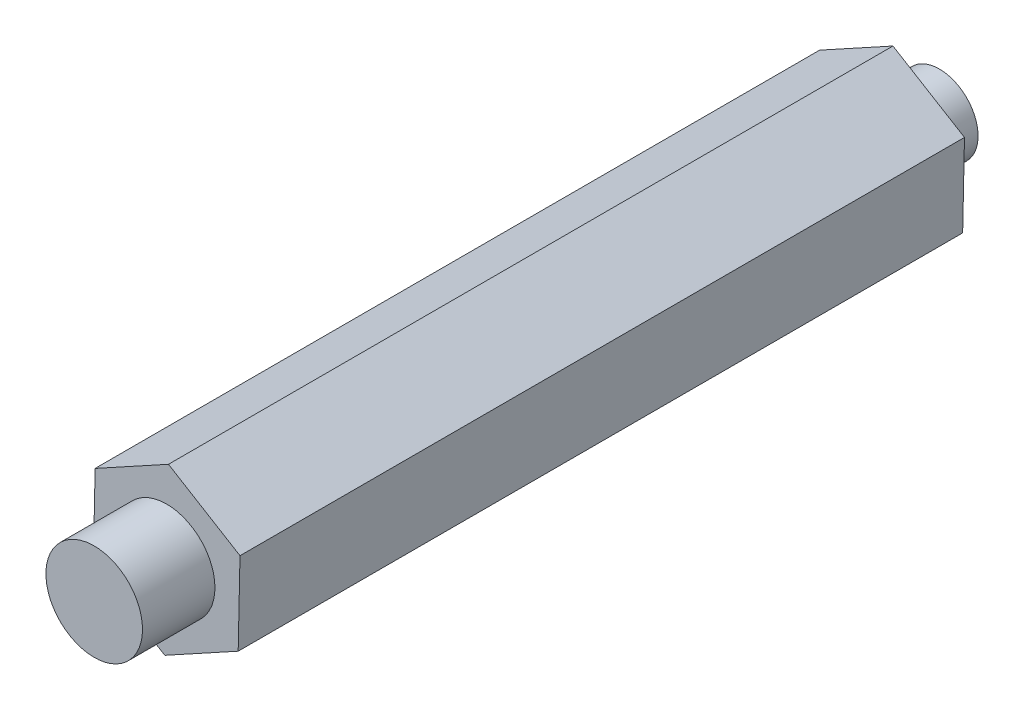
ISO-10303-21;
HEADER;
FILE_DESCRIPTION(('STEP AP214'),'2;1');
FILE_NAME('part.step','',(''),(''),'','','');
FILE_SCHEMA(('AUTOMOTIVE_DESIGN { 1 0 10303 214 1 1 1 1 }'));
ENDSEC;
DATA;
#1=APPLICATION_CONTEXT('core data for automotive mechanical design processes');
#2=APPLICATION_PROTOCOL_DEFINITION('international standard','automotive_design',2000,#1);
#3=PRODUCT_CONTEXT('',#1,'mechanical');
#4=PRODUCT('Part','Part','',(#3));
#5=PRODUCT_RELATED_PRODUCT_CATEGORY('part','',(#4));
#6=PRODUCT_DEFINITION_FORMATION('','',#4);
#7=PRODUCT_DEFINITION_CONTEXT('part definition',#1,'design');
#8=PRODUCT_DEFINITION('design','',#6,#7);
#9=PRODUCT_DEFINITION_SHAPE('','',#8);
#10=(LENGTH_UNIT() NAMED_UNIT(*) SI_UNIT(.MILLI.,.METRE.));
#11=(NAMED_UNIT(*) PLANE_ANGLE_UNIT() SI_UNIT($,.RADIAN.));
#12=(NAMED_UNIT(*) SI_UNIT($,.STERADIAN.) SOLID_ANGLE_UNIT());
#13=UNCERTAINTY_MEASURE_WITH_UNIT(LENGTH_MEASURE(1.E-05),#10,'distance_accuracy_value','');
#14=(GEOMETRIC_REPRESENTATION_CONTEXT(3) GLOBAL_UNCERTAINTY_ASSIGNED_CONTEXT((#13)) GLOBAL_UNIT_ASSIGNED_CONTEXT((#10,
#11,#12)) REPRESENTATION_CONTEXT('',''));
#15=CARTESIAN_POINT('',(0.,0.,0.));
#16=DIRECTION('',(0.,0.,1.));
#17=DIRECTION('',(1.,0.,0.));
#18=AXIS2_PLACEMENT_3D('',#15,#16,#17);
#19=CARTESIAN_POINT('',(-0.0753833749567967,-3.46328129766846,30.));
#20=DIRECTION('',(-0.481035753632871,0.876700977373047,0.));
#21=DIRECTION('',(-0.876700977373047,-0.481035753632871,0.));
#22=AXIS2_PLACEMENT_3D('',#19,#20,#21);
#23=PLANE('',#22);
#24=DIRECTION('',(0.876700977373047,0.481035753632871,0.));
#25=VECTOR('',#24,1.);
#26=CARTESIAN_POINT('',(-0.0753833749567967,-3.46328129766846,0.));
#27=LINE('',#26,#25);
#28=CARTESIAN_POINT('',(-0.0753833749567967,-3.46328129766846,0.));
#29=VERTEX_POINT('',#28);
#30=CARTESIAN_POINT('',(2.96159789675402,-1.79692456656982,0.));
#31=VERTEX_POINT('',#30);
#32=EDGE_CURVE('E124',#29,#31,#27,.T.);
#33=ORIENTED_EDGE('',*,*,#32,.T.);
#34=DIRECTION('',(0.,0.,-1.));
#35=VECTOR('',#34,1.);
#36=CARTESIAN_POINT('',(2.96159789675402,-1.79692456656982,30.));
#37=LINE('',#36,#35);
#38=CARTESIAN_POINT('',(2.96159789675402,-1.79692456656982,30.));
#39=VERTEX_POINT('',#38);
#40=EDGE_CURVE('E40',#39,#31,#37,.T.);
#41=ORIENTED_EDGE('',*,*,#40,.F.);
#42=DIRECTION('',(0.876700977373047,0.481035753632871,0.));
#43=VECTOR('',#42,1.);
#44=CARTESIAN_POINT('',(-0.0753833749567967,-3.46328129766846,30.));
#45=LINE('',#44,#43);
#46=CARTESIAN_POINT('',(-0.0753833749567967,-3.46328129766846,30.));
#47=VERTEX_POINT('',#46);
#48=EDGE_CURVE('E135',#47,#39,#45,.T.);
#49=ORIENTED_EDGE('',*,*,#48,.F.);
#50=DIRECTION('',(0.,0.,-1.));
#51=VECTOR('',#50,1.);
#52=CARTESIAN_POINT('',(-0.0753833749567967,-3.46328129766846,30.));
#53=LINE('',#52,#51);
#54=EDGE_CURVE('E120',#47,#29,#53,.T.);
#55=ORIENTED_EDGE('',*,*,#54,.T.);
#56=EDGE_LOOP('',(#33,#41,#49,#55));
#57=FACE_BOUND('',#56,.T.);
#58=ADVANCED_FACE('F37',(#57),#23,.F.);
#59=CARTESIAN_POINT('',(2.96159789675402,-1.79692456656982,30.));
#60=DIRECTION('',(-0.99976319474414,0.0217613059118645,0.));
#61=DIRECTION('',(-0.0217613059118645,-0.999763194744141,0.));
#62=AXIS2_PLACEMENT_3D('',#59,#60,#61);
#63=PLANE('',#62);
#64=DIRECTION('',(0.0217613059118645,0.99976319474414,0.));
#65=VECTOR('',#64,1.);
#66=CARTESIAN_POINT('',(2.96159789675402,-1.79692456656982,0.));
#67=LINE('',#66,#65);
#68=CARTESIAN_POINT('',(3.03698127171082,1.66635673109864,0.));
#69=VERTEX_POINT('',#68);
#70=EDGE_CURVE('E127',#31,#69,#67,.T.);
#71=ORIENTED_EDGE('',*,*,#70,.T.);
#72=DIRECTION('',(0.,0.,-1.));
#73=VECTOR('',#72,1.);
#74=CARTESIAN_POINT('',(3.03698127171082,1.66635673109864,30.));
#75=LINE('',#74,#73);
#76=CARTESIAN_POINT('',(3.03698127171082,1.66635673109864,30.));
#77=VERTEX_POINT('',#76);
#78=EDGE_CURVE('E138',#77,#69,#75,.T.);
#79=ORIENTED_EDGE('',*,*,#78,.F.);
#80=DIRECTION('',(0.0217613059118645,0.99976319474414,0.));
#81=VECTOR('',#80,1.);
#82=CARTESIAN_POINT('',(2.96159789675402,-1.79692456656982,30.));
#83=LINE('',#82,#81);
#84=EDGE_CURVE('E93',#39,#77,#83,.T.);
#85=ORIENTED_EDGE('',*,*,#84,.F.);
#86=ORIENTED_EDGE('',*,*,#40,.T.);
#87=EDGE_LOOP('',(#71,#79,#85,#86));
#88=FACE_BOUND('',#87,.T.);
#89=ADVANCED_FACE('F151',(#88),#63,.F.);
#90=CARTESIAN_POINT('',(3.03698127171082,1.66635673109864,30.));
#91=DIRECTION('',(-0.518727441111269,-0.854939671461183,0.));
#92=DIRECTION('',(0.854939671461183,-0.518727441111269,0.));
#93=AXIS2_PLACEMENT_3D('',#90,#91,#92);
#94=PLANE('',#93);
#95=DIRECTION('',(-0.854939671461183,0.518727441111269,0.));
#96=VECTOR('',#95,1.);
#97=CARTESIAN_POINT('',(3.03698127171082,1.66635673109864,0.));
#98=LINE('',#97,#96);
#99=CARTESIAN_POINT('',(0.0753833749567957,3.46328129766846,0.));
#100=VERTEX_POINT('',#99);
#101=EDGE_CURVE('E130',#69,#100,#98,.T.);
#102=ORIENTED_EDGE('',*,*,#101,.T.);
#103=DIRECTION('',(0.,0.,-1.));
#104=VECTOR('',#103,1.);
#105=CARTESIAN_POINT('',(0.0753833749567957,3.46328129766846,30.));
#106=LINE('',#105,#104);
#107=CARTESIAN_POINT('',(0.0753833749567957,3.46328129766846,30.));
#108=VERTEX_POINT('',#107);
#109=EDGE_CURVE('E115',#108,#100,#106,.T.);
#110=ORIENTED_EDGE('',*,*,#109,.F.);
#111=DIRECTION('',(-0.854939671461183,0.518727441111269,0.));
#112=VECTOR('',#111,1.);
#113=CARTESIAN_POINT('',(3.03698127171082,1.66635673109864,30.));
#114=LINE('',#113,#112);
#115=EDGE_CURVE('E106',#77,#108,#114,.T.);
#116=ORIENTED_EDGE('',*,*,#115,.F.);
#117=ORIENTED_EDGE('',*,*,#78,.T.);
#118=EDGE_LOOP('',(#102,#110,#116,#117));
#119=FACE_BOUND('',#118,.T.);
#120=ADVANCED_FACE('F152',(#119),#94,.F.);
#121=CARTESIAN_POINT('',(0.0753833749567957,3.46328129766846,30.));
#122=DIRECTION('',(0.481035753632871,-0.876700977373047,0.));
#123=DIRECTION('',(0.876700977373047,0.481035753632871,0.));
#124=AXIS2_PLACEMENT_3D('',#121,#122,#123);
#125=PLANE('',#124);
#126=DIRECTION('',(-0.876700977373047,-0.481035753632871,0.));
#127=VECTOR('',#126,1.);
#128=CARTESIAN_POINT('',(0.0753833749567957,3.46328129766846,0.));
#129=LINE('',#128,#127);
#130=CARTESIAN_POINT('',(-2.96159789675402,1.79692456656982,0.));
#131=VERTEX_POINT('',#130);
#132=EDGE_CURVE('E114',#100,#131,#129,.T.);
#133=ORIENTED_EDGE('',*,*,#132,.T.);
#134=DIRECTION('',(0.,0.,-1.));
#135=VECTOR('',#134,1.);
#136=CARTESIAN_POINT('',(-2.96159789675402,1.79692456656982,30.));
#137=LINE('',#136,#135);
#138=CARTESIAN_POINT('',(-2.96159789675402,1.79692456656982,30.));
#139=VERTEX_POINT('',#138);
#140=EDGE_CURVE('E111',#139,#131,#137,.T.);
#141=ORIENTED_EDGE('',*,*,#140,.F.);
#142=DIRECTION('',(-0.876700977373047,-0.481035753632871,0.));
#143=VECTOR('',#142,1.);
#144=CARTESIAN_POINT('',(0.0753833749567957,3.46328129766846,30.));
#145=LINE('',#144,#143);
#146=EDGE_CURVE('E100',#108,#139,#145,.T.);
#147=ORIENTED_EDGE('',*,*,#146,.F.);
#148=ORIENTED_EDGE('',*,*,#109,.T.);
#149=EDGE_LOOP('',(#133,#141,#147,#148));
#150=FACE_BOUND('',#149,.T.);
#151=ADVANCED_FACE('F112',(#150),#125,.F.);
#152=CARTESIAN_POINT('',(-2.96159789675402,1.79692456656982,30.));
#153=DIRECTION('',(0.99976319474414,-0.0217613059118645,0.));
#154=DIRECTION('',(0.0217613059118645,0.999763194744141,0.));
#155=AXIS2_PLACEMENT_3D('',#152,#153,#154);
#156=PLANE('',#155);
#157=DIRECTION('',(-0.0217613059118645,-0.99976319474414,0.));
#158=VECTOR('',#157,1.);
#159=CARTESIAN_POINT('',(-2.96159789675402,1.79692456656982,0.));
#160=LINE('',#159,#158);
#161=CARTESIAN_POINT('',(-3.03698127171082,-1.66635673109864,0.));
#162=VERTEX_POINT('',#161);
#163=EDGE_CURVE('E78',#131,#162,#160,.T.);
#164=ORIENTED_EDGE('',*,*,#163,.T.);
#165=DIRECTION('',(0.,0.,-1.));
#166=VECTOR('',#165,1.);
#167=CARTESIAN_POINT('',(-3.03698127171082,-1.66635673109864,30.));
#168=LINE('',#167,#166);
#169=CARTESIAN_POINT('',(-3.03698127171082,-1.66635673109864,30.));
#170=VERTEX_POINT('',#169);
#171=EDGE_CURVE('E116',#170,#162,#168,.T.);
#172=ORIENTED_EDGE('',*,*,#171,.F.);
#173=DIRECTION('',(-0.0217613059118645,-0.99976319474414,0.));
#174=VECTOR('',#173,1.);
#175=CARTESIAN_POINT('',(-2.96159789675402,1.79692456656982,30.));
#176=LINE('',#175,#174);
#177=EDGE_CURVE('E104',#139,#170,#176,.T.);
#178=ORIENTED_EDGE('',*,*,#177,.F.);
#179=ORIENTED_EDGE('',*,*,#140,.T.);
#180=EDGE_LOOP('',(#164,#172,#178,#179));
#181=FACE_BOUND('',#180,.T.);
#182=ADVANCED_FACE('F118',(#181),#156,.F.);
#183=CARTESIAN_POINT('',(-3.03698127171082,-1.66635673109864,30.));
#184=DIRECTION('',(0.518727441111269,0.854939671461182,0.));
#185=DIRECTION('',(-0.854939671461183,0.518727441111269,0.));
#186=AXIS2_PLACEMENT_3D('',#183,#184,#185);
#187=PLANE('',#186);
#188=DIRECTION('',(0.854939671461183,-0.518727441111269,0.));
#189=VECTOR('',#188,1.);
#190=CARTESIAN_POINT('',(-3.03698127171082,-1.66635673109864,0.));
#191=LINE('',#190,#189);
#192=EDGE_CURVE('E84',#162,#29,#191,.T.);
#193=ORIENTED_EDGE('',*,*,#192,.T.);
#194=ORIENTED_EDGE('',*,*,#54,.F.);
#195=DIRECTION('',(0.854939671461183,-0.518727441111269,0.));
#196=VECTOR('',#195,1.);
#197=CARTESIAN_POINT('',(-3.03698127171082,-1.66635673109864,30.));
#198=LINE('',#197,#196);
#199=EDGE_CURVE('E55',#170,#47,#198,.T.);
#200=ORIENTED_EDGE('',*,*,#199,.F.);
#201=ORIENTED_EDGE('',*,*,#171,.T.);
#202=EDGE_LOOP('',(#193,#194,#200,#201));
#203=FACE_BOUND('',#202,.T.);
#204=ADVANCED_FACE('F157',(#203),#187,.F.);
#205=CARTESIAN_POINT('',(0.,0.,30.));
#206=DIRECTION('',(0.,0.,1.));
#207=DIRECTION('',(1.,0.,0.));
#208=AXIS2_PLACEMENT_3D('',#205,#206,#207);
#209=PLANE('',#208);
#210=CARTESIAN_POINT('',(0.,0.,30.));
#211=DIRECTION('',(0.,0.,1.));
#212=DIRECTION('',(1.,0.,0.));
#213=AXIS2_PLACEMENT_3D('',#210,#211,#212);
#214=CIRCLE('',#213,2.);
#215=CARTESIAN_POINT('',(2.,0.,30.));
#216=VERTEX_POINT('',#215);
#217=EDGE_CURVE('E46',#216,#216,#214,.T.);
#218=ORIENTED_EDGE('',*,*,#217,.F.);
#219=EDGE_LOOP('',(#218));
#220=FACE_BOUND('',#219,.T.);
#221=ORIENTED_EDGE('',*,*,#48,.T.);
#222=ORIENTED_EDGE('',*,*,#84,.T.);
#223=ORIENTED_EDGE('',*,*,#115,.T.);
#224=ORIENTED_EDGE('',*,*,#146,.T.);
#225=ORIENTED_EDGE('',*,*,#177,.T.);
#226=ORIENTED_EDGE('',*,*,#199,.T.);
#227=EDGE_LOOP('',(#221,#222,#223,#224,#225,#226));
#228=FACE_BOUND('',#227,.T.);
#229=ADVANCED_FACE('F102',(#220,#228),#209,.T.);
#230=CARTESIAN_POINT('',(0.,0.,0.));
#231=DIRECTION('',(0.,0.,1.));
#232=DIRECTION('',(1.,0.,0.));
#233=AXIS2_PLACEMENT_3D('',#230,#231,#232);
#234=PLANE('',#233);
#235=CARTESIAN_POINT('',(0.,0.,0.));
#236=DIRECTION('',(0.,0.,-1.));
#237=DIRECTION('',(-1.,0.,0.));
#238=AXIS2_PLACEMENT_3D('',#235,#236,#237);
#239=CIRCLE('',#238,1.6);
#240=CARTESIAN_POINT('',(-1.6,0.,0.));
#241=VERTEX_POINT('',#240);
#242=EDGE_CURVE('E11',#241,#241,#239,.T.);
#243=ORIENTED_EDGE('',*,*,#242,.F.);
#244=EDGE_LOOP('',(#243));
#245=FACE_BOUND('',#244,.T.);
#246=ORIENTED_EDGE('',*,*,#32,.F.);
#247=ORIENTED_EDGE('',*,*,#192,.F.);
#248=ORIENTED_EDGE('',*,*,#163,.F.);
#249=ORIENTED_EDGE('',*,*,#132,.F.);
#250=ORIENTED_EDGE('',*,*,#101,.F.);
#251=ORIENTED_EDGE('',*,*,#70,.F.);
#252=EDGE_LOOP('',(#246,#247,#248,#249,#250,#251));
#253=FACE_BOUND('',#252,.T.);
#254=ADVANCED_FACE('F155',(#245,#253),#234,.F.);
#255=CARTESIAN_POINT('',(0.,0.,33.));
#256=DIRECTION('',(0.,0.,-1.));
#257=DIRECTION('',(-1.,0.,0.));
#258=AXIS2_PLACEMENT_3D('',#255,#256,#257);
#259=CYLINDRICAL_SURFACE('',#258,2.);
#260=CARTESIAN_POINT('',(0.,0.,33.));
#261=DIRECTION('',(0.,0.,1.));
#262=DIRECTION('',(1.,0.,0.));
#263=AXIS2_PLACEMENT_3D('',#260,#261,#262);
#264=CIRCLE('',#263,2.);
#265=CARTESIAN_POINT('',(2.,0.,33.));
#266=VERTEX_POINT('',#265);
#267=EDGE_CURVE('E128',#266,#266,#264,.T.);
#268=ORIENTED_EDGE('',*,*,#267,.F.);
#269=EDGE_LOOP('',(#268));
#270=FACE_BOUND('',#269,.T.);
#271=ORIENTED_EDGE('',*,*,#217,.T.);
#272=EDGE_LOOP('',(#271));
#273=FACE_BOUND('',#272,.T.);
#274=ADVANCED_FACE('F206',(#270,#273),#259,.T.);
#275=CARTESIAN_POINT('',(0.,0.,33.));
#276=DIRECTION('',(0.,0.,1.));
#277=DIRECTION('',(1.,0.,0.));
#278=AXIS2_PLACEMENT_3D('',#275,#276,#277);
#279=PLANE('',#278);
#280=ORIENTED_EDGE('',*,*,#267,.T.);
#281=EDGE_LOOP('',(#280));
#282=FACE_BOUND('',#281,.T.);
#283=ADVANCED_FACE('F211',(#282),#279,.T.);
#284=CARTESIAN_POINT('',(0.,0.,-2.));
#285=DIRECTION('',(0.,0.,1.));
#286=DIRECTION('',(1.,0.,0.));
#287=AXIS2_PLACEMENT_3D('',#284,#285,#286);
#288=CYLINDRICAL_SURFACE('',#287,1.6);
#289=CARTESIAN_POINT('',(0.,0.,-2.));
#290=DIRECTION('',(0.,0.,-1.));
#291=DIRECTION('',(-1.,0.,0.));
#292=AXIS2_PLACEMENT_3D('',#289,#290,#291);
#293=CIRCLE('',#292,1.6);
#294=CARTESIAN_POINT('',(-1.6,0.,-2.));
#295=VERTEX_POINT('',#294);
#296=EDGE_CURVE('E288',#295,#295,#293,.T.);
#297=ORIENTED_EDGE('',*,*,#296,.F.);
#298=EDGE_LOOP('',(#297));
#299=FACE_BOUND('',#298,.T.);
#300=ORIENTED_EDGE('',*,*,#242,.T.);
#301=EDGE_LOOP('',(#300));
#302=FACE_BOUND('',#301,.T.);
#303=ADVANCED_FACE('F222',(#299,#302),#288,.T.);
#304=CARTESIAN_POINT('',(0.,0.,-2.));
#305=DIRECTION('',(0.,0.,-1.));
#306=DIRECTION('',(-1.,0.,0.));
#307=AXIS2_PLACEMENT_3D('',#304,#305,#306);
#308=PLANE('',#307);
#309=ORIENTED_EDGE('',*,*,#296,.T.);
#310=EDGE_LOOP('',(#309));
#311=FACE_BOUND('',#310,.T.);
#312=ADVANCED_FACE('F237',(#311),#308,.T.);
#313=CLOSED_SHELL('',(#58,#89,#120,#151,#182,#204,#229,#254,#274,#283,#303,#312));
#314=MANIFOLD_SOLID_BREP('B2',#313);
#315=ADVANCED_BREP_SHAPE_REPRESENTATION('',(#18,#314),#14);
#316=SHAPE_DEFINITION_REPRESENTATION(#9,#315);
ENDSEC;
END-ISO-10303-21;
